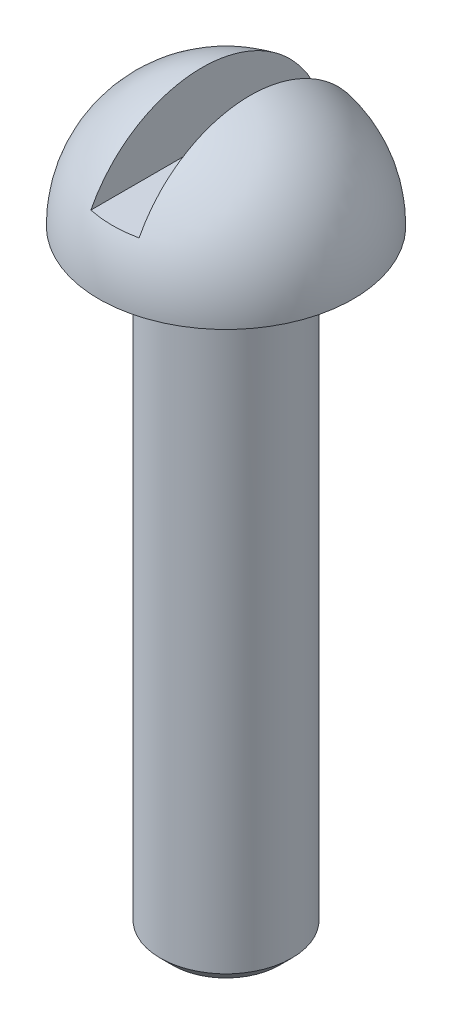
ISO-10303-21;
HEADER;
FILE_DESCRIPTION(('STEP AP214'),'2;1');
FILE_NAME('part.step','',(''),(''),'','','');
FILE_SCHEMA(('AUTOMOTIVE_DESIGN { 1 0 10303 214 1 1 1 1 }'));
ENDSEC;
DATA;
#1=APPLICATION_CONTEXT('core data for automotive mechanical design processes');
#2=APPLICATION_PROTOCOL_DEFINITION('international standard','automotive_design',2000,#1);
#3=PRODUCT_CONTEXT('',#1,'mechanical');
#4=PRODUCT('Part','Part','',(#3));
#5=PRODUCT_RELATED_PRODUCT_CATEGORY('part','',(#4));
#6=PRODUCT_DEFINITION_FORMATION('','',#4);
#7=PRODUCT_DEFINITION_CONTEXT('part definition',#1,'design');
#8=PRODUCT_DEFINITION('design','',#6,#7);
#9=PRODUCT_DEFINITION_SHAPE('','',#8);
#10=(LENGTH_UNIT() NAMED_UNIT(*) SI_UNIT(.MILLI.,.METRE.));
#11=(NAMED_UNIT(*) PLANE_ANGLE_UNIT() SI_UNIT($,.RADIAN.));
#12=(NAMED_UNIT(*) SI_UNIT($,.STERADIAN.) SOLID_ANGLE_UNIT());
#13=UNCERTAINTY_MEASURE_WITH_UNIT(LENGTH_MEASURE(1.E-05),#10,'distance_accuracy_value','');
#14=(GEOMETRIC_REPRESENTATION_CONTEXT(3) GLOBAL_UNCERTAINTY_ASSIGNED_CONTEXT((#13)) GLOBAL_UNIT_ASSIGNED_CONTEXT((#10,
#11,#12)) REPRESENTATION_CONTEXT('',''));
#15=CARTESIAN_POINT('',(0.,0.,0.));
#16=DIRECTION('',(0.,0.,1.));
#17=DIRECTION('',(1.,0.,0.));
#18=AXIS2_PLACEMENT_3D('',#15,#16,#17);
#19=CARTESIAN_POINT('',(0.,0.,0.));
#20=DIRECTION('',(0.,1.,0.));
#21=DIRECTION('',(1.,0.,0.));
#22=AXIS2_PLACEMENT_3D('',#19,#20,#21);
#23=SPHERICAL_SURFACE('',#22,2.9);
#24=CARTESIAN_POINT('',(0.55,0.,0.));
#25=DIRECTION('',(1.,0.,0.));
#26=DIRECTION('',(0.,1.,0.));
#27=AXIS2_PLACEMENT_3D('',#24,#25,#26);
#28=CIRCLE('',#27,2.84736720498077);
#29=CARTESIAN_POINT('',(0.55,1.3,2.53327850817867));
#30=VERTEX_POINT('',#29);
#31=CARTESIAN_POINT('',(0.550000000000229,1.3,-2.53327850817868));
#32=VERTEX_POINT('',#31);
#33=EDGE_CURVE('E11',#30,#32,#28,.F.);
#34=ORIENTED_EDGE('',*,*,#33,.F.);
#35=CARTESIAN_POINT('',(0.,1.3,0.));
#36=DIRECTION('',(0.,-1.,0.));
#37=DIRECTION('',(0.,0.,-1.));
#38=AXIS2_PLACEMENT_3D('',#35,#36,#37);
#39=CIRCLE('',#38,2.59229627936314);
#40=CARTESIAN_POINT('',(-0.55,1.3,2.53327850817868));
#41=VERTEX_POINT('',#40);
#42=EDGE_CURVE('E48',#41,#30,#39,.F.);
#43=ORIENTED_EDGE('',*,*,#42,.F.);
#44=CARTESIAN_POINT('',(-0.55,0.,0.));
#45=DIRECTION('',(-1.,0.,0.));
#46=DIRECTION('',(0.,-1.,0.));
#47=AXIS2_PLACEMENT_3D('',#44,#45,#46);
#48=CIRCLE('',#47,2.84736720498077);
#49=CARTESIAN_POINT('',(-0.549999999999771,1.3,-2.53327850817868));
#50=VERTEX_POINT('',#49);
#51=EDGE_CURVE('E66',#50,#41,#48,.F.);
#52=ORIENTED_EDGE('',*,*,#51,.F.);
#53=EDGE_CURVE('E70',#32,#50,#39,.F.);
#54=ORIENTED_EDGE('',*,*,#53,.F.);
#55=EDGE_LOOP('',(#34,#43,#52,#54));
#56=FACE_BOUND('',#55,.T.);
#57=CARTESIAN_POINT('',(0.,0.,0.));
#58=DIRECTION('',(0.,1.,0.));
#59=DIRECTION('',(-1.,0.,0.));
#60=AXIS2_PLACEMENT_3D('',#57,#58,#59);
#61=CIRCLE('',#60,2.9);
#62=CARTESIAN_POINT('',(-2.9,0.,0.));
#63=VERTEX_POINT('',#62);
#64=EDGE_CURVE('E87',#63,#63,#61,.T.);
#65=ORIENTED_EDGE('',*,*,#64,.T.);
#66=EDGE_LOOP('',(#65));
#67=FACE_BOUND('',#66,.T.);
#68=ADVANCED_FACE('F40',(#56,#67),#23,.T.);
#69=CARTESIAN_POINT('',(0.,-14.,0.));
#70=DIRECTION('',(0.,-1.,0.));
#71=DIRECTION('',(1.,0.,0.));
#72=AXIS2_PLACEMENT_3D('',#69,#70,#71);
#73=PLANE('',#72);
#74=CARTESIAN_POINT('',(0.,-14.,0.));
#75=DIRECTION('',(0.,-1.,0.));
#76=DIRECTION('',(1.,0.,0.));
#77=AXIS2_PLACEMENT_3D('',#74,#75,#76);
#78=CIRCLE('',#77,1.21949999999999);
#79=CARTESIAN_POINT('',(1.2195,-14.,0.));
#80=VERTEX_POINT('',#79);
#81=EDGE_CURVE('E71',#80,#80,#78,.T.);
#82=ORIENTED_EDGE('',*,*,#81,.T.);
#83=EDGE_LOOP('',(#82));
#84=FACE_BOUND('',#83,.T.);
#85=ADVANCED_FACE('F104',(#84),#73,.T.);
#86=CARTESIAN_POINT('',(0.,2.9,0.));
#87=DIRECTION('',(0.,1.,0.));
#88=DIRECTION('',(-1.,0.,0.));
#89=AXIS2_PLACEMENT_3D('',#86,#87,#88);
#90=CYLINDRICAL_SURFACE('',#89,1.5);
#91=CARTESIAN_POINT('',(0.,-13.7195,-1.2490009027033E-13));
#92=DIRECTION('',(0.,-1.,0.));
#93=DIRECTION('',(1.,0.,0.));
#94=AXIS2_PLACEMENT_3D('',#91,#92,#93);
#95=CIRCLE('',#94,1.5);
#96=CARTESIAN_POINT('',(1.5,-13.7195,-1.2490009027033E-13));
#97=VERTEX_POINT('',#96);
#98=EDGE_CURVE('E81',#97,#97,#95,.F.);
#99=ORIENTED_EDGE('',*,*,#98,.T.);
#100=EDGE_LOOP('',(#99));
#101=FACE_BOUND('',#100,.T.);
#102=CARTESIAN_POINT('',(0.,0.,0.));
#103=DIRECTION('',(0.,1.,0.));
#104=DIRECTION('',(-1.,0.,0.));
#105=AXIS2_PLACEMENT_3D('',#102,#103,#104);
#106=CIRCLE('',#105,1.5);
#107=CARTESIAN_POINT('',(-1.5,0.,0.));
#108=VERTEX_POINT('',#107);
#109=EDGE_CURVE('E84',#108,#108,#106,.T.);
#110=ORIENTED_EDGE('',*,*,#109,.F.);
#111=EDGE_LOOP('',(#110));
#112=FACE_BOUND('',#111,.T.);
#113=ADVANCED_FACE('F108',(#101,#112),#90,.T.);
#114=CARTESIAN_POINT('',(0.,0.,0.));
#115=DIRECTION('',(0.,-1.,0.));
#116=DIRECTION('',(1.,0.,0.));
#117=AXIS2_PLACEMENT_3D('',#114,#115,#116);
#118=PLANE('',#117);
#119=ORIENTED_EDGE('',*,*,#109,.T.);
#120=EDGE_LOOP('',(#119));
#121=FACE_BOUND('',#120,.T.);
#122=ORIENTED_EDGE('',*,*,#64,.F.);
#123=EDGE_LOOP('',(#122));
#124=FACE_BOUND('',#123,.T.);
#125=ADVANCED_FACE('F99',(#121,#124),#118,.T.);
#126=CARTESIAN_POINT('',(0.,-13.7195,-1.2490009027033E-13));
#127=DIRECTION('',(0.,1.,0.));
#128=DIRECTION('',(-1.,0.,0.));
#129=AXIS2_PLACEMENT_3D('',#126,#127,#128);
#130=CONICAL_SURFACE('',#129,1.5,0.785398163397456);
#131=ORIENTED_EDGE('',*,*,#81,.F.);
#132=EDGE_LOOP('',(#131));
#133=FACE_BOUND('',#132,.T.);
#134=ORIENTED_EDGE('',*,*,#98,.F.);
#135=EDGE_LOOP('',(#134));
#136=FACE_BOUND('',#135,.T.);
#137=ADVANCED_FACE('F42',(#133,#136),#130,.T.);
#138=CARTESIAN_POINT('',(0.550000000000229,1.30000000000006,-2.9));
#139=DIRECTION('',(1.,0.,0.));
#140=DIRECTION('',(0.,1.,0.));
#141=AXIS2_PLACEMENT_3D('',#138,#139,#140);
#142=PLANE('',#141);
#143=ORIENTED_EDGE('',*,*,#33,.T.);
#144=DIRECTION('',(0.,0.,1.));
#145=VECTOR('',#144,1.);
#146=CARTESIAN_POINT('',(0.550000000000229,1.30000000000006,-2.9));
#147=LINE('',#146,#145);
#148=EDGE_CURVE('E74',#32,#30,#147,.T.);
#149=ORIENTED_EDGE('',*,*,#148,.T.);
#150=EDGE_LOOP('',(#143,#149));
#151=FACE_BOUND('',#150,.T.);
#152=ADVANCED_FACE('F91',(#151),#142,.F.);
#153=CARTESIAN_POINT('',(-0.549999999999771,1.3,-2.9));
#154=DIRECTION('',(0.,-1.,0.));
#155=DIRECTION('',(0.,0.,-1.));
#156=AXIS2_PLACEMENT_3D('',#153,#154,#155);
#157=PLANE('',#156);
#158=ORIENTED_EDGE('',*,*,#42,.T.);
#159=ORIENTED_EDGE('',*,*,#148,.F.);
#160=ORIENTED_EDGE('',*,*,#53,.T.);
#161=DIRECTION('',(0.,0.,1.));
#162=VECTOR('',#161,1.);
#163=CARTESIAN_POINT('',(-0.549999999999771,1.3,-2.9));
#164=LINE('',#163,#162);
#165=EDGE_CURVE('E54',#50,#41,#164,.T.);
#166=ORIENTED_EDGE('',*,*,#165,.T.);
#167=EDGE_LOOP('',(#158,#159,#160,#166));
#168=FACE_BOUND('',#167,.T.);
#169=ADVANCED_FACE('F73',(#168),#157,.F.);
#170=CARTESIAN_POINT('',(-0.549999999999771,1.3,-2.9));
#171=DIRECTION('',(-1.,0.,0.));
#172=DIRECTION('',(0.,-1.,0.));
#173=AXIS2_PLACEMENT_3D('',#170,#171,#172);
#174=PLANE('',#173);
#175=ORIENTED_EDGE('',*,*,#51,.T.);
#176=ORIENTED_EDGE('',*,*,#165,.F.);
#177=EDGE_LOOP('',(#175,#176));
#178=FACE_BOUND('',#177,.T.);
#179=ADVANCED_FACE('F67',(#178),#174,.F.);
#180=CLOSED_SHELL('',(#68,#85,#113,#125,#137,#152,#169,#179));
#181=MANIFOLD_SOLID_BREP('B2',#180);
#182=ADVANCED_BREP_SHAPE_REPRESENTATION('',(#18,#181),#14);
#183=SHAPE_DEFINITION_REPRESENTATION(#9,#182);
ENDSEC;
END-ISO-10303-21;
